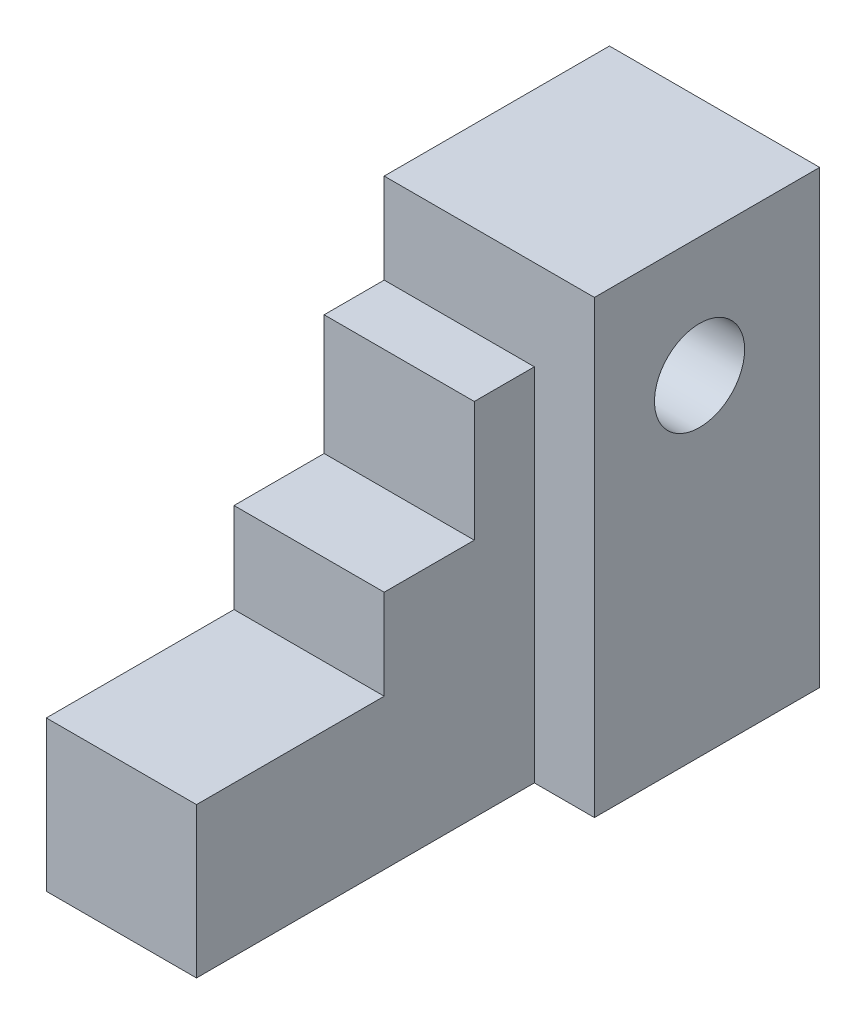
ISO-10303-21;
HEADER;
FILE_DESCRIPTION(('STEP AP214'),'2;1');
FILE_NAME('part.step','',(''),(''),'','','');
FILE_SCHEMA(('AUTOMOTIVE_DESIGN { 1 0 10303 214 1 1 1 1 }'));
ENDSEC;
DATA;
#1=APPLICATION_CONTEXT('core data for automotive mechanical design processes');
#2=APPLICATION_PROTOCOL_DEFINITION('international standard','automotive_design',2000,#1);
#3=PRODUCT_CONTEXT('',#1,'mechanical');
#4=PRODUCT('Part','Part','',(#3));
#5=PRODUCT_RELATED_PRODUCT_CATEGORY('part','',(#4));
#6=PRODUCT_DEFINITION_FORMATION('','',#4);
#7=PRODUCT_DEFINITION_CONTEXT('part definition',#1,'design');
#8=PRODUCT_DEFINITION('design','',#6,#7);
#9=PRODUCT_DEFINITION_SHAPE('','',#8);
#10=(LENGTH_UNIT() NAMED_UNIT(*) SI_UNIT(.MILLI.,.METRE.));
#11=(NAMED_UNIT(*) PLANE_ANGLE_UNIT() SI_UNIT($,.RADIAN.));
#12=(NAMED_UNIT(*) SI_UNIT($,.STERADIAN.) SOLID_ANGLE_UNIT());
#13=UNCERTAINTY_MEASURE_WITH_UNIT(LENGTH_MEASURE(1.E-05),#10,'distance_accuracy_value','');
#14=(GEOMETRIC_REPRESENTATION_CONTEXT(3) GLOBAL_UNCERTAINTY_ASSIGNED_CONTEXT((#13)) GLOBAL_UNIT_ASSIGNED_CONTEXT((#10,
#11,#12)) REPRESENTATION_CONTEXT('',''));
#15=CARTESIAN_POINT('',(0.,0.,0.));
#16=DIRECTION('',(0.,0.,1.));
#17=DIRECTION('',(1.,0.,0.));
#18=AXIS2_PLACEMENT_3D('',#15,#16,#17);
#19=CARTESIAN_POINT('',(28.,0.,75.));
#20=DIRECTION('',(0.,1.,0.));
#21=DIRECTION('',(0.,0.,1.));
#22=AXIS2_PLACEMENT_3D('',#19,#20,#21);
#23=PLANE('',#22);
#24=DIRECTION('',(1.,0.,0.));
#25=VECTOR('',#24,1.);
#26=CARTESIAN_POINT('',(20.,0.,30.));
#27=LINE('',#26,#25);
#28=CARTESIAN_POINT('',(20.,0.,30.));
#29=VERTEX_POINT('',#28);
#30=CARTESIAN_POINT('',(28.,0.,30.));
#31=VERTEX_POINT('',#30);
#32=EDGE_CURVE('E140',#29,#31,#27,.T.);
#33=ORIENTED_EDGE('',*,*,#32,.F.);
#34=DIRECTION('',(0.,0.,1.));
#35=VECTOR('',#34,1.);
#36=CARTESIAN_POINT('',(20.,0.,0.));
#37=LINE('',#36,#35);
#38=CARTESIAN_POINT('',(20.,0.,75.));
#39=VERTEX_POINT('',#38);
#40=EDGE_CURVE('E127',#29,#39,#37,.T.);
#41=ORIENTED_EDGE('',*,*,#40,.T.);
#42=DIRECTION('',(-1.,0.,0.));
#43=VECTOR('',#42,1.);
#44=CARTESIAN_POINT('',(28.,0.,75.));
#45=LINE('',#44,#43);
#46=CARTESIAN_POINT('',(0.,0.,75.));
#47=VERTEX_POINT('',#46);
#48=EDGE_CURVE('E98',#39,#47,#45,.T.);
#49=ORIENTED_EDGE('',*,*,#48,.T.);
#50=DIRECTION('',(0.,0.,-1.));
#51=VECTOR('',#50,1.);
#52=CARTESIAN_POINT('',(0.,0.,75.));
#53=LINE('',#52,#51);
#54=CARTESIAN_POINT('',(0.,0.,0.));
#55=VERTEX_POINT('',#54);
#56=EDGE_CURVE('E145',#47,#55,#53,.T.);
#57=ORIENTED_EDGE('',*,*,#56,.T.);
#58=DIRECTION('',(-1.,0.,0.));
#59=VECTOR('',#58,1.);
#60=CARTESIAN_POINT('',(28.,0.,0.));
#61=LINE('',#60,#59);
#62=CARTESIAN_POINT('',(28.,0.,0.));
#63=VERTEX_POINT('',#62);
#64=EDGE_CURVE('E11',#63,#55,#61,.T.);
#65=ORIENTED_EDGE('',*,*,#64,.F.);
#66=DIRECTION('',(0.,0.,-1.));
#67=VECTOR('',#66,1.);
#68=CARTESIAN_POINT('',(28.,0.,75.));
#69=LINE('',#68,#67);
#70=EDGE_CURVE('E101',#31,#63,#69,.T.);
#71=ORIENTED_EDGE('',*,*,#70,.F.);
#72=EDGE_LOOP('',(#33,#41,#49,#57,#65,#71));
#73=FACE_BOUND('',#72,.T.);
#74=ADVANCED_FACE('F39',(#73),#23,.F.);
#75=CARTESIAN_POINT('',(28.,0.,0.));
#76=DIRECTION('',(1.,0.,0.));
#77=DIRECTION('',(0.,0.,-1.));
#78=AXIS2_PLACEMENT_3D('',#75,#76,#77);
#79=PLANE('',#78);
#80=CARTESIAN_POINT('',(28.,44.,16.));
#81=DIRECTION('',(1.,0.,0.));
#82=DIRECTION('',(0.,0.,-1.));
#83=AXIS2_PLACEMENT_3D('',#80,#81,#82);
#84=CIRCLE('',#83,6.);
#85=CARTESIAN_POINT('',(28.,44.,10.));
#86=VERTEX_POINT('',#85);
#87=EDGE_CURVE('E142',#86,#86,#84,.T.);
#88=ORIENTED_EDGE('',*,*,#87,.F.);
#89=EDGE_LOOP('',(#88));
#90=FACE_BOUND('',#89,.T.);
#91=DIRECTION('',(0.,-1.,0.));
#92=VECTOR('',#91,1.);
#93=CARTESIAN_POINT('',(28.,48.,30.));
#94=LINE('',#93,#92);
#95=CARTESIAN_POINT('',(28.,60.,30.));
#96=VERTEX_POINT('',#95);
#97=EDGE_CURVE('E53',#96,#31,#94,.T.);
#98=ORIENTED_EDGE('',*,*,#97,.T.);
#99=ORIENTED_EDGE('',*,*,#70,.T.);
#100=DIRECTION('',(0.,1.,0.));
#101=VECTOR('',#100,1.);
#102=CARTESIAN_POINT('',(28.,0.,0.));
#103=LINE('',#102,#101);
#104=CARTESIAN_POINT('',(28.,60.,0.));
#105=VERTEX_POINT('',#104);
#106=EDGE_CURVE('E155',#63,#105,#103,.T.);
#107=ORIENTED_EDGE('',*,*,#106,.T.);
#108=DIRECTION('',(0.,0.,1.));
#109=VECTOR('',#108,1.);
#110=CARTESIAN_POINT('',(28.,60.,30.));
#111=LINE('',#110,#109);
#112=EDGE_CURVE('E59',#105,#96,#111,.T.);
#113=ORIENTED_EDGE('',*,*,#112,.T.);
#114=EDGE_LOOP('',(#98,#99,#107,#113));
#115=FACE_BOUND('',#114,.T.);
#116=ADVANCED_FACE('F235',(#90,#115),#79,.T.);
#117=CARTESIAN_POINT('',(28.,0.,0.));
#118=DIRECTION('',(0.,0.,1.));
#119=DIRECTION('',(1.,0.,0.));
#120=AXIS2_PLACEMENT_3D('',#117,#118,#119);
#121=PLANE('',#120);
#122=DIRECTION('',(0.,1.,0.));
#123=VECTOR('',#122,1.);
#124=CARTESIAN_POINT('',(0.,0.,0.));
#125=LINE('',#124,#123);
#126=CARTESIAN_POINT('',(0.,60.,0.));
#127=VERTEX_POINT('',#126);
#128=EDGE_CURVE('E148',#55,#127,#125,.T.);
#129=ORIENTED_EDGE('',*,*,#128,.T.);
#130=DIRECTION('',(-1.,0.,0.));
#131=VECTOR('',#130,1.);
#132=CARTESIAN_POINT('',(28.,60.,0.));
#133=LINE('',#132,#131);
#134=EDGE_CURVE('E46',#105,#127,#133,.T.);
#135=ORIENTED_EDGE('',*,*,#134,.F.);
#136=ORIENTED_EDGE('',*,*,#106,.F.);
#137=ORIENTED_EDGE('',*,*,#64,.T.);
#138=EDGE_LOOP('',(#129,#135,#136,#137));
#139=FACE_BOUND('',#138,.T.);
#140=ADVANCED_FACE('F237',(#139),#121,.F.);
#141=CARTESIAN_POINT('',(28.,60.,30.));
#142=DIRECTION('',(0.,-1.,0.));
#143=DIRECTION('',(0.,0.,-1.));
#144=AXIS2_PLACEMENT_3D('',#141,#142,#143);
#145=PLANE('',#144);
#146=DIRECTION('',(0.,0.,1.));
#147=VECTOR('',#146,1.);
#148=CARTESIAN_POINT('',(0.,60.,30.));
#149=LINE('',#148,#147);
#150=CARTESIAN_POINT('',(0.,60.,30.));
#151=VERTEX_POINT('',#150);
#152=EDGE_CURVE('E161',#127,#151,#149,.T.);
#153=ORIENTED_EDGE('',*,*,#152,.T.);
#154=DIRECTION('',(-1.,0.,0.));
#155=VECTOR('',#154,1.);
#156=CARTESIAN_POINT('',(28.,60.,30.));
#157=LINE('',#156,#155);
#158=EDGE_CURVE('E193',#96,#151,#157,.T.);
#159=ORIENTED_EDGE('',*,*,#158,.F.);
#160=ORIENTED_EDGE('',*,*,#112,.F.);
#161=ORIENTED_EDGE('',*,*,#134,.T.);
#162=EDGE_LOOP('',(#153,#159,#160,#161));
#163=FACE_BOUND('',#162,.T.);
#164=ADVANCED_FACE('F199',(#163),#145,.F.);
#165=CARTESIAN_POINT('',(28.,48.,30.));
#166=DIRECTION('',(0.,0.,-1.));
#167=DIRECTION('',(-1.,0.,0.));
#168=AXIS2_PLACEMENT_3D('',#165,#166,#167);
#169=PLANE('',#168);
#170=DIRECTION('',(0.,-1.,0.));
#171=VECTOR('',#170,1.);
#172=CARTESIAN_POINT('',(0.,48.,30.));
#173=LINE('',#172,#171);
#174=CARTESIAN_POINT('',(0.,48.,30.));
#175=VERTEX_POINT('',#174);
#176=EDGE_CURVE('E163',#151,#175,#173,.T.);
#177=ORIENTED_EDGE('',*,*,#176,.T.);
#178=DIRECTION('',(-1.,0.,0.));
#179=VECTOR('',#178,1.);
#180=CARTESIAN_POINT('',(28.,48.,30.));
#181=LINE('',#180,#179);
#182=CARTESIAN_POINT('',(20.,48.,30.));
#183=VERTEX_POINT('',#182);
#184=EDGE_CURVE('E141',#183,#175,#181,.T.);
#185=ORIENTED_EDGE('',*,*,#184,.F.);
#186=DIRECTION('',(0.,-1.,0.));
#187=VECTOR('',#186,1.);
#188=CARTESIAN_POINT('',(20.,0.,30.));
#189=LINE('',#188,#187);
#190=EDGE_CURVE('E130',#183,#29,#189,.T.);
#191=ORIENTED_EDGE('',*,*,#190,.T.);
#192=ORIENTED_EDGE('',*,*,#32,.T.);
#193=ORIENTED_EDGE('',*,*,#97,.F.);
#194=ORIENTED_EDGE('',*,*,#158,.T.);
#195=EDGE_LOOP('',(#177,#185,#191,#192,#193,#194));
#196=FACE_BOUND('',#195,.T.);
#197=ADVANCED_FACE('F139',(#196),#169,.F.);
#198=CARTESIAN_POINT('',(28.,48.,38.));
#199=DIRECTION('',(0.,-1.,0.));
#200=DIRECTION('',(0.,0.,-1.));
#201=AXIS2_PLACEMENT_3D('',#198,#199,#200);
#202=PLANE('',#201);
#203=DIRECTION('',(-1.,0.,0.));
#204=VECTOR('',#203,1.);
#205=CARTESIAN_POINT('',(28.,48.,38.));
#206=LINE('',#205,#204);
#207=CARTESIAN_POINT('',(20.,48.,38.));
#208=VERTEX_POINT('',#207);
#209=CARTESIAN_POINT('',(0.,48.,38.));
#210=VERTEX_POINT('',#209);
#211=EDGE_CURVE('E190',#208,#210,#206,.T.);
#212=ORIENTED_EDGE('',*,*,#211,.F.);
#213=DIRECTION('',(0.,0.,-1.));
#214=VECTOR('',#213,1.);
#215=CARTESIAN_POINT('',(20.,48.,0.));
#216=LINE('',#215,#214);
#217=EDGE_CURVE('E146',#208,#183,#216,.T.);
#218=ORIENTED_EDGE('',*,*,#217,.T.);
#219=ORIENTED_EDGE('',*,*,#184,.T.);
#220=DIRECTION('',(0.,0.,1.));
#221=VECTOR('',#220,1.);
#222=CARTESIAN_POINT('',(0.,48.,38.));
#223=LINE('',#222,#221);
#224=EDGE_CURVE('E165',#175,#210,#223,.T.);
#225=ORIENTED_EDGE('',*,*,#224,.T.);
#226=EDGE_LOOP('',(#212,#218,#219,#225));
#227=FACE_BOUND('',#226,.T.);
#228=ADVANCED_FACE('F210',(#227),#202,.F.);
#229=CARTESIAN_POINT('',(28.,32.,38.));
#230=DIRECTION('',(0.,0.,-1.));
#231=DIRECTION('',(-1.,0.,0.));
#232=AXIS2_PLACEMENT_3D('',#229,#230,#231);
#233=PLANE('',#232);
#234=DIRECTION('',(-1.,0.,0.));
#235=VECTOR('',#234,1.);
#236=CARTESIAN_POINT('',(28.,32.,38.));
#237=LINE('',#236,#235);
#238=CARTESIAN_POINT('',(20.,32.,38.));
#239=VERTEX_POINT('',#238);
#240=CARTESIAN_POINT('',(0.,32.,38.));
#241=VERTEX_POINT('',#240);
#242=EDGE_CURVE('E188',#239,#241,#237,.T.);
#243=ORIENTED_EDGE('',*,*,#242,.F.);
#244=DIRECTION('',(0.,1.,0.));
#245=VECTOR('',#244,1.);
#246=CARTESIAN_POINT('',(20.,0.,38.));
#247=LINE('',#246,#245);
#248=EDGE_CURVE('E150',#239,#208,#247,.T.);
#249=ORIENTED_EDGE('',*,*,#248,.T.);
#250=ORIENTED_EDGE('',*,*,#211,.T.);
#251=DIRECTION('',(0.,-1.,0.));
#252=VECTOR('',#251,1.);
#253=CARTESIAN_POINT('',(0.,32.,38.));
#254=LINE('',#253,#252);
#255=EDGE_CURVE('E168',#210,#241,#254,.T.);
#256=ORIENTED_EDGE('',*,*,#255,.T.);
#257=EDGE_LOOP('',(#243,#249,#250,#256));
#258=FACE_BOUND('',#257,.T.);
#259=ADVANCED_FACE('F215',(#258),#233,.F.);
#260=CARTESIAN_POINT('',(28.,32.,50.));
#261=DIRECTION('',(0.,-1.,0.));
#262=DIRECTION('',(0.,0.,-1.));
#263=AXIS2_PLACEMENT_3D('',#260,#261,#262);
#264=PLANE('',#263);
#265=DIRECTION('',(-1.,0.,0.));
#266=VECTOR('',#265,1.);
#267=CARTESIAN_POINT('',(28.,32.,50.));
#268=LINE('',#267,#266);
#269=CARTESIAN_POINT('',(20.,32.,50.));
#270=VERTEX_POINT('',#269);
#271=CARTESIAN_POINT('',(0.,32.,50.));
#272=VERTEX_POINT('',#271);
#273=EDGE_CURVE('E186',#270,#272,#268,.T.);
#274=ORIENTED_EDGE('',*,*,#273,.F.);
#275=DIRECTION('',(0.,0.,-1.));
#276=VECTOR('',#275,1.);
#277=CARTESIAN_POINT('',(20.,32.,0.));
#278=LINE('',#277,#276);
#279=EDGE_CURVE('E216',#270,#239,#278,.T.);
#280=ORIENTED_EDGE('',*,*,#279,.T.);
#281=ORIENTED_EDGE('',*,*,#242,.T.);
#282=DIRECTION('',(0.,0.,1.));
#283=VECTOR('',#282,1.);
#284=CARTESIAN_POINT('',(0.,32.,50.));
#285=LINE('',#284,#283);
#286=EDGE_CURVE('E171',#241,#272,#285,.T.);
#287=ORIENTED_EDGE('',*,*,#286,.T.);
#288=EDGE_LOOP('',(#274,#280,#281,#287));
#289=FACE_BOUND('',#288,.T.);
#290=ADVANCED_FACE('F261',(#289),#264,.F.);
#291=CARTESIAN_POINT('',(28.,20.,50.));
#292=DIRECTION('',(0.,0.,-1.));
#293=DIRECTION('',(-1.,0.,0.));
#294=AXIS2_PLACEMENT_3D('',#291,#292,#293);
#295=PLANE('',#294);
#296=DIRECTION('',(-1.,0.,0.));
#297=VECTOR('',#296,1.);
#298=CARTESIAN_POINT('',(28.,20.,50.));
#299=LINE('',#298,#297);
#300=CARTESIAN_POINT('',(20.,20.,50.));
#301=VERTEX_POINT('',#300);
#302=CARTESIAN_POINT('',(0.,20.,50.));
#303=VERTEX_POINT('',#302);
#304=EDGE_CURVE('E184',#301,#303,#299,.T.);
#305=ORIENTED_EDGE('',*,*,#304,.F.);
#306=DIRECTION('',(0.,1.,0.));
#307=VECTOR('',#306,1.);
#308=CARTESIAN_POINT('',(20.,0.,50.));
#309=LINE('',#308,#307);
#310=EDGE_CURVE('E217',#301,#270,#309,.T.);
#311=ORIENTED_EDGE('',*,*,#310,.T.);
#312=ORIENTED_EDGE('',*,*,#273,.T.);
#313=DIRECTION('',(0.,-1.,0.));
#314=VECTOR('',#313,1.);
#315=CARTESIAN_POINT('',(0.,20.,50.));
#316=LINE('',#315,#314);
#317=EDGE_CURVE('E174',#272,#303,#316,.T.);
#318=ORIENTED_EDGE('',*,*,#317,.T.);
#319=EDGE_LOOP('',(#305,#311,#312,#318));
#320=FACE_BOUND('',#319,.T.);
#321=ADVANCED_FACE('F257',(#320),#295,.F.);
#322=CARTESIAN_POINT('',(28.,20.,75.));
#323=DIRECTION('',(0.,-1.,0.));
#324=DIRECTION('',(0.,0.,-1.));
#325=AXIS2_PLACEMENT_3D('',#322,#323,#324);
#326=PLANE('',#325);
#327=DIRECTION('',(-1.,0.,0.));
#328=VECTOR('',#327,1.);
#329=CARTESIAN_POINT('',(28.,20.,75.));
#330=LINE('',#329,#328);
#331=CARTESIAN_POINT('',(20.,20.,75.));
#332=VERTEX_POINT('',#331);
#333=CARTESIAN_POINT('',(0.,20.,75.));
#334=VERTEX_POINT('',#333);
#335=EDGE_CURVE('E182',#332,#334,#330,.T.);
#336=ORIENTED_EDGE('',*,*,#335,.F.);
#337=DIRECTION('',(0.,0.,-1.));
#338=VECTOR('',#337,1.);
#339=CARTESIAN_POINT('',(20.,20.,0.));
#340=LINE('',#339,#338);
#341=EDGE_CURVE('E222',#332,#301,#340,.T.);
#342=ORIENTED_EDGE('',*,*,#341,.T.);
#343=ORIENTED_EDGE('',*,*,#304,.T.);
#344=DIRECTION('',(0.,0.,1.));
#345=VECTOR('',#344,1.);
#346=CARTESIAN_POINT('',(0.,20.,75.));
#347=LINE('',#346,#345);
#348=EDGE_CURVE('E177',#303,#334,#347,.T.);
#349=ORIENTED_EDGE('',*,*,#348,.T.);
#350=EDGE_LOOP('',(#336,#342,#343,#349));
#351=FACE_BOUND('',#350,.T.);
#352=ADVANCED_FACE('F253',(#351),#326,.F.);
#353=CARTESIAN_POINT('',(28.,0.,75.));
#354=DIRECTION('',(0.,0.,-1.));
#355=DIRECTION('',(-1.,0.,0.));
#356=AXIS2_PLACEMENT_3D('',#353,#354,#355);
#357=PLANE('',#356);
#358=ORIENTED_EDGE('',*,*,#48,.F.);
#359=DIRECTION('',(0.,1.,0.));
#360=VECTOR('',#359,1.);
#361=CARTESIAN_POINT('',(20.,0.,75.));
#362=LINE('',#361,#360);
#363=EDGE_CURVE('E133',#39,#332,#362,.T.);
#364=ORIENTED_EDGE('',*,*,#363,.T.);
#365=ORIENTED_EDGE('',*,*,#335,.T.);
#366=DIRECTION('',(0.,-1.,0.));
#367=VECTOR('',#366,1.);
#368=CARTESIAN_POINT('',(0.,0.,75.));
#369=LINE('',#368,#367);
#370=EDGE_CURVE('E156',#334,#47,#369,.T.);
#371=ORIENTED_EDGE('',*,*,#370,.T.);
#372=EDGE_LOOP('',(#358,#364,#365,#371));
#373=FACE_BOUND('',#372,.T.);
#374=ADVANCED_FACE('F249',(#373),#357,.F.);
#375=CARTESIAN_POINT('',(0.,0.,0.));
#376=DIRECTION('',(1.,0.,0.));
#377=DIRECTION('',(0.,0.,-1.));
#378=AXIS2_PLACEMENT_3D('',#375,#376,#377);
#379=PLANE('',#378);
#380=CARTESIAN_POINT('',(0.,44.,16.));
#381=DIRECTION('',(1.,0.,0.));
#382=DIRECTION('',(0.,0.,-1.));
#383=AXIS2_PLACEMENT_3D('',#380,#381,#382);
#384=CIRCLE('',#383,6.);
#385=CARTESIAN_POINT('',(0.,44.,10.));
#386=VERTEX_POINT('',#385);
#387=EDGE_CURVE('E226',#386,#386,#384,.T.);
#388=ORIENTED_EDGE('',*,*,#387,.T.);
#389=EDGE_LOOP('',(#388));
#390=FACE_BOUND('',#389,.T.);
#391=ORIENTED_EDGE('',*,*,#56,.F.);
#392=ORIENTED_EDGE('',*,*,#370,.F.);
#393=ORIENTED_EDGE('',*,*,#348,.F.);
#394=ORIENTED_EDGE('',*,*,#317,.F.);
#395=ORIENTED_EDGE('',*,*,#286,.F.);
#396=ORIENTED_EDGE('',*,*,#255,.F.);
#397=ORIENTED_EDGE('',*,*,#224,.F.);
#398=ORIENTED_EDGE('',*,*,#176,.F.);
#399=ORIENTED_EDGE('',*,*,#152,.F.);
#400=ORIENTED_EDGE('',*,*,#128,.F.);
#401=EDGE_LOOP('',(#391,#392,#393,#394,#395,#396,#397,#398,#399,#400));
#402=FACE_BOUND('',#401,.T.);
#403=ADVANCED_FACE('F204',(#390,#402),#379,.F.);
#404=CARTESIAN_POINT('',(20.,0.,0.));
#405=DIRECTION('',(-1.,0.,0.));
#406=DIRECTION('',(0.,0.,1.));
#407=AXIS2_PLACEMENT_3D('',#404,#405,#406);
#408=PLANE('',#407);
#409=ORIENTED_EDGE('',*,*,#190,.F.);
#410=ORIENTED_EDGE('',*,*,#217,.F.);
#411=ORIENTED_EDGE('',*,*,#248,.F.);
#412=ORIENTED_EDGE('',*,*,#279,.F.);
#413=ORIENTED_EDGE('',*,*,#310,.F.);
#414=ORIENTED_EDGE('',*,*,#341,.F.);
#415=ORIENTED_EDGE('',*,*,#363,.F.);
#416=ORIENTED_EDGE('',*,*,#40,.F.);
#417=EDGE_LOOP('',(#409,#410,#411,#412,#413,#414,#415,#416));
#418=FACE_BOUND('',#417,.T.);
#419=ADVANCED_FACE('F129',(#418),#408,.F.);
#420=CARTESIAN_POINT('',(28.,44.,16.));
#421=DIRECTION('',(-1.,0.,0.));
#422=DIRECTION('',(0.,0.,1.));
#423=AXIS2_PLACEMENT_3D('',#420,#421,#422);
#424=CYLINDRICAL_SURFACE('',#423,6.);
#425=ORIENTED_EDGE('',*,*,#87,.T.);
#426=EDGE_LOOP('',(#425));
#427=FACE_BOUND('',#426,.T.);
#428=ORIENTED_EDGE('',*,*,#387,.F.);
#429=EDGE_LOOP('',(#428));
#430=FACE_BOUND('',#429,.T.);
#431=ADVANCED_FACE('F232',(#427,#430),#424,.F.);
#432=CLOSED_SHELL('',(#74,#116,#140,#164,#197,#228,#259,#290,#321,#352,#374,#403,#419,#431));
#433=MANIFOLD_SOLID_BREP('B2',#432);
#434=ADVANCED_BREP_SHAPE_REPRESENTATION('',(#18,#433),#14);
#435=SHAPE_DEFINITION_REPRESENTATION(#9,#434);
ENDSEC;
END-ISO-10303-21;
